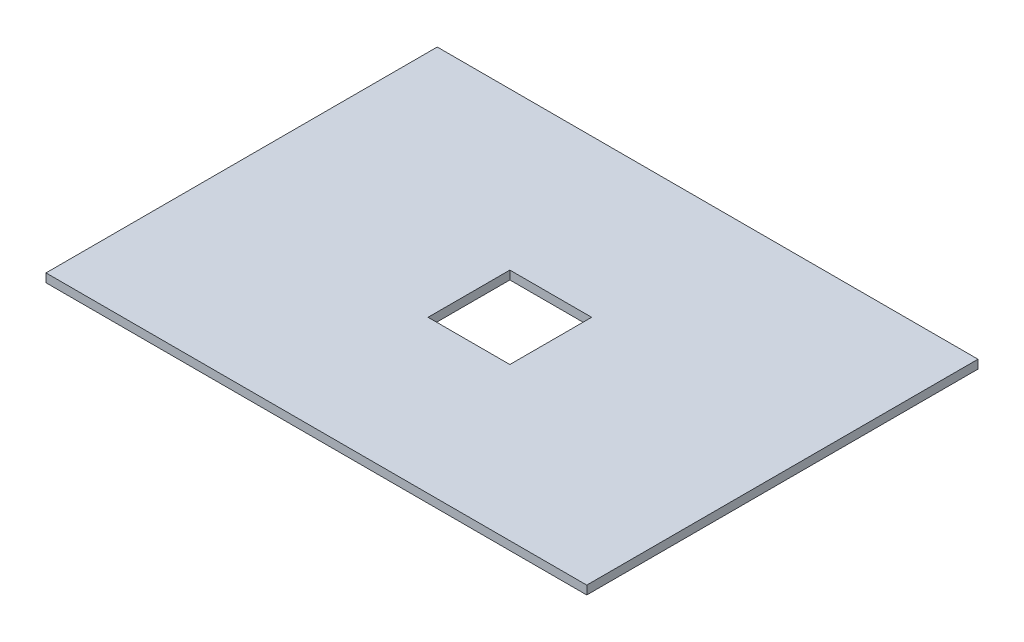
ISO-10303-21;
HEADER;
FILE_DESCRIPTION(('STEP AP214'),'2;1');
FILE_NAME('part.step','',(''),(''),'','','');
FILE_SCHEMA(('AUTOMOTIVE_DESIGN { 1 0 10303 214 1 1 1 1 }'));
ENDSEC;
DATA;
#1=APPLICATION_CONTEXT('core data for automotive mechanical design processes');
#2=APPLICATION_PROTOCOL_DEFINITION('international standard','automotive_design',2000,#1);
#3=PRODUCT_CONTEXT('',#1,'mechanical');
#4=PRODUCT('Part','Part','',(#3));
#5=PRODUCT_RELATED_PRODUCT_CATEGORY('part','',(#4));
#6=PRODUCT_DEFINITION_FORMATION('','',#4);
#7=PRODUCT_DEFINITION_CONTEXT('part definition',#1,'design');
#8=PRODUCT_DEFINITION('design','',#6,#7);
#9=PRODUCT_DEFINITION_SHAPE('','',#8);
#10=(LENGTH_UNIT() NAMED_UNIT(*) SI_UNIT(.MILLI.,.METRE.));
#11=(NAMED_UNIT(*) PLANE_ANGLE_UNIT() SI_UNIT($,.RADIAN.));
#12=(NAMED_UNIT(*) SI_UNIT($,.STERADIAN.) SOLID_ANGLE_UNIT());
#13=UNCERTAINTY_MEASURE_WITH_UNIT(LENGTH_MEASURE(1.E-05),#10,'distance_accuracy_value','');
#14=(GEOMETRIC_REPRESENTATION_CONTEXT(3) GLOBAL_UNCERTAINTY_ASSIGNED_CONTEXT((#13)) GLOBAL_UNIT_ASSIGNED_CONTEXT((#10,
#11,#12)) REPRESENTATION_CONTEXT('',''));
#15=CARTESIAN_POINT('',(0.,0.,0.));
#16=DIRECTION('',(0.,0.,1.));
#17=DIRECTION('',(1.,0.,0.));
#18=AXIS2_PLACEMENT_3D('',#15,#16,#17);
#19=CARTESIAN_POINT('',(0.,6.35,0.));
#20=DIRECTION('',(0.,-1.,0.));
#21=DIRECTION('',(0.,0.,-1.));
#22=AXIS2_PLACEMENT_3D('',#19,#20,#21);
#23=PLANE('',#22);
#24=DIRECTION('',(0.,0.,1.));
#25=VECTOR('',#24,1.);
#26=CARTESIAN_POINT('',(0.,6.35,0.));
#27=LINE('',#26,#25);
#28=CARTESIAN_POINT('',(0.,6.35,-289.4));
#29=VERTEX_POINT('',#28);
#30=CARTESIAN_POINT('',(0.,6.35,0.));
#31=VERTEX_POINT('',#30);
#32=EDGE_CURVE('E153',#29,#31,#27,.T.);
#33=ORIENTED_EDGE('',*,*,#32,.T.);
#34=DIRECTION('',(1.,0.,0.));
#35=VECTOR('',#34,1.);
#36=CARTESIAN_POINT('',(0.,6.35,0.));
#37=LINE('',#36,#35);
#38=CARTESIAN_POINT('',(400.,6.35,0.));
#39=VERTEX_POINT('',#38);
#40=EDGE_CURVE('E157',#31,#39,#37,.T.);
#41=ORIENTED_EDGE('',*,*,#40,.T.);
#42=DIRECTION('',(0.,0.,-1.));
#43=VECTOR('',#42,1.);
#44=CARTESIAN_POINT('',(400.,6.35,0.));
#45=LINE('',#44,#43);
#46=CARTESIAN_POINT('',(400.,6.35,-289.4));
#47=VERTEX_POINT('',#46);
#48=EDGE_CURVE('E161',#39,#47,#45,.T.);
#49=ORIENTED_EDGE('',*,*,#48,.T.);
#50=DIRECTION('',(-1.,0.,0.));
#51=VECTOR('',#50,1.);
#52=CARTESIAN_POINT('',(393.65,6.35,-289.4));
#53=LINE('',#52,#51);
#54=EDGE_CURVE('E164',#47,#29,#53,.T.);
#55=ORIENTED_EDGE('',*,*,#54,.T.);
#56=EDGE_LOOP('',(#33,#41,#49,#55));
#57=FACE_BOUND('',#56,.T.);
#58=DIRECTION('',(0.,0.,1.));
#59=VECTOR('',#58,1.);
#60=CARTESIAN_POINT('',(169.75,6.35,-173.36));
#61=LINE('',#60,#59);
#62=CARTESIAN_POINT('',(169.75,6.35,-173.36));
#63=VERTEX_POINT('',#62);
#64=CARTESIAN_POINT('',(169.75,6.35,-112.86));
#65=VERTEX_POINT('',#64);
#66=EDGE_CURVE('E105',#63,#65,#61,.T.);
#67=ORIENTED_EDGE('',*,*,#66,.F.);
#68=DIRECTION('',(-1.,0.,0.));
#69=VECTOR('',#68,1.);
#70=CARTESIAN_POINT('',(169.75,6.35,-173.36));
#71=LINE('',#70,#69);
#72=CARTESIAN_POINT('',(230.25,6.35,-173.36));
#73=VERTEX_POINT('',#72);
#74=EDGE_CURVE('E131',#73,#63,#71,.T.);
#75=ORIENTED_EDGE('',*,*,#74,.F.);
#76=DIRECTION('',(0.,0.,-1.));
#77=VECTOR('',#76,1.);
#78=CARTESIAN_POINT('',(230.25,6.35,-173.36));
#79=LINE('',#78,#77);
#80=CARTESIAN_POINT('',(230.25,6.35,-112.86));
#81=VERTEX_POINT('',#80);
#82=EDGE_CURVE('E127',#81,#73,#79,.T.);
#83=ORIENTED_EDGE('',*,*,#82,.F.);
#84=DIRECTION('',(1.,0.,0.));
#85=VECTOR('',#84,1.);
#86=CARTESIAN_POINT('',(169.75,6.35,-112.86));
#87=LINE('',#86,#85);
#88=EDGE_CURVE('E114',#65,#81,#87,.T.);
#89=ORIENTED_EDGE('',*,*,#88,.F.);
#90=EDGE_LOOP('',(#67,#75,#83,#89));
#91=FACE_BOUND('',#90,.T.);
#92=ADVANCED_FACE('F39',(#57,#91),#23,.F.);
#93=CARTESIAN_POINT('',(0.,0.,0.));
#94=DIRECTION('',(0.,-1.,0.));
#95=DIRECTION('',(0.,0.,-1.));
#96=AXIS2_PLACEMENT_3D('',#93,#94,#95);
#97=PLANE('',#96);
#98=DIRECTION('',(0.,0.,1.));
#99=VECTOR('',#98,1.);
#100=CARTESIAN_POINT('',(0.,0.,0.));
#101=LINE('',#100,#99);
#102=CARTESIAN_POINT('',(0.,0.,-289.4));
#103=VERTEX_POINT('',#102);
#104=CARTESIAN_POINT('',(0.,0.,0.));
#105=VERTEX_POINT('',#104);
#106=EDGE_CURVE('E123',#103,#105,#101,.T.);
#107=ORIENTED_EDGE('',*,*,#106,.F.);
#108=DIRECTION('',(-1.,0.,0.));
#109=VECTOR('',#108,1.);
#110=CARTESIAN_POINT('',(0.,0.,-289.4));
#111=LINE('',#110,#109);
#112=CARTESIAN_POINT('',(400.,0.,-289.4));
#113=VERTEX_POINT('',#112);
#114=EDGE_CURVE('E158',#113,#103,#111,.T.);
#115=ORIENTED_EDGE('',*,*,#114,.F.);
#116=DIRECTION('',(0.,0.,-1.));
#117=VECTOR('',#116,1.);
#118=CARTESIAN_POINT('',(400.,0.,0.));
#119=LINE('',#118,#117);
#120=CARTESIAN_POINT('',(400.,0.,0.));
#121=VERTEX_POINT('',#120);
#122=EDGE_CURVE('E174',#121,#113,#119,.T.);
#123=ORIENTED_EDGE('',*,*,#122,.F.);
#124=DIRECTION('',(1.,0.,0.));
#125=VECTOR('',#124,1.);
#126=CARTESIAN_POINT('',(0.,0.,0.));
#127=LINE('',#126,#125);
#128=EDGE_CURVE('E171',#105,#121,#127,.T.);
#129=ORIENTED_EDGE('',*,*,#128,.F.);
#130=EDGE_LOOP('',(#107,#115,#123,#129));
#131=FACE_BOUND('',#130,.T.);
#132=DIRECTION('',(-1.,0.,0.));
#133=VECTOR('',#132,1.);
#134=CARTESIAN_POINT('',(169.75,0.,-173.36));
#135=LINE('',#134,#133);
#136=CARTESIAN_POINT('',(230.25,0.,-173.36));
#137=VERTEX_POINT('',#136);
#138=CARTESIAN_POINT('',(169.75,0.,-173.36));
#139=VERTEX_POINT('',#138);
#140=EDGE_CURVE('E115',#137,#139,#135,.T.);
#141=ORIENTED_EDGE('',*,*,#140,.T.);
#142=DIRECTION('',(0.,0.,1.));
#143=VECTOR('',#142,1.);
#144=CARTESIAN_POINT('',(169.75,0.,-173.36));
#145=LINE('',#144,#143);
#146=CARTESIAN_POINT('',(169.75,0.,-112.86));
#147=VERTEX_POINT('',#146);
#148=EDGE_CURVE('E63',#139,#147,#145,.T.);
#149=ORIENTED_EDGE('',*,*,#148,.T.);
#150=DIRECTION('',(1.,0.,0.));
#151=VECTOR('',#150,1.);
#152=CARTESIAN_POINT('',(169.75,0.,-112.86));
#153=LINE('',#152,#151);
#154=CARTESIAN_POINT('',(230.25,0.,-112.86));
#155=VERTEX_POINT('',#154);
#156=EDGE_CURVE('E121',#147,#155,#153,.T.);
#157=ORIENTED_EDGE('',*,*,#156,.T.);
#158=DIRECTION('',(0.,0.,-1.));
#159=VECTOR('',#158,1.);
#160=CARTESIAN_POINT('',(230.25,0.,-173.36));
#161=LINE('',#160,#159);
#162=EDGE_CURVE('E140',#155,#137,#161,.T.);
#163=ORIENTED_EDGE('',*,*,#162,.T.);
#164=EDGE_LOOP('',(#141,#149,#157,#163));
#165=FACE_BOUND('',#164,.T.);
#166=ADVANCED_FACE('F197',(#131,#165),#97,.T.);
#167=CARTESIAN_POINT('',(0.,6.35,0.));
#168=DIRECTION('',(1.,0.,0.));
#169=DIRECTION('',(0.,0.,-1.));
#170=AXIS2_PLACEMENT_3D('',#167,#168,#169);
#171=PLANE('',#170);
#172=ORIENTED_EDGE('',*,*,#106,.T.);
#173=DIRECTION('',(0.,-1.,0.));
#174=VECTOR('',#173,1.);
#175=CARTESIAN_POINT('',(0.,6.35,0.));
#176=LINE('',#175,#174);
#177=EDGE_CURVE('E11',#31,#105,#176,.T.);
#178=ORIENTED_EDGE('',*,*,#177,.F.);
#179=ORIENTED_EDGE('',*,*,#32,.F.);
#180=DIRECTION('',(0.,-1.,0.));
#181=VECTOR('',#180,1.);
#182=CARTESIAN_POINT('',(0.,6.35,-289.4));
#183=LINE('',#182,#181);
#184=EDGE_CURVE('E167',#29,#103,#183,.T.);
#185=ORIENTED_EDGE('',*,*,#184,.T.);
#186=EDGE_LOOP('',(#172,#178,#179,#185));
#187=FACE_BOUND('',#186,.T.);
#188=ADVANCED_FACE('F41',(#187),#171,.F.);
#189=CARTESIAN_POINT('',(0.,6.35,0.));
#190=DIRECTION('',(0.,0.,-1.));
#191=DIRECTION('',(-1.,0.,0.));
#192=AXIS2_PLACEMENT_3D('',#189,#190,#191);
#193=PLANE('',#192);
#194=ORIENTED_EDGE('',*,*,#128,.T.);
#195=DIRECTION('',(0.,-1.,0.));
#196=VECTOR('',#195,1.);
#197=CARTESIAN_POINT('',(400.,6.35,0.));
#198=LINE('',#197,#196);
#199=EDGE_CURVE('E48',#39,#121,#198,.T.);
#200=ORIENTED_EDGE('',*,*,#199,.F.);
#201=ORIENTED_EDGE('',*,*,#40,.F.);
#202=ORIENTED_EDGE('',*,*,#177,.T.);
#203=EDGE_LOOP('',(#194,#200,#201,#202));
#204=FACE_BOUND('',#203,.T.);
#205=ADVANCED_FACE('F207',(#204),#193,.F.);
#206=CARTESIAN_POINT('',(400.,6.35,0.));
#207=DIRECTION('',(-1.,0.,0.));
#208=DIRECTION('',(0.,0.,1.));
#209=AXIS2_PLACEMENT_3D('',#206,#207,#208);
#210=PLANE('',#209);
#211=ORIENTED_EDGE('',*,*,#122,.T.);
#212=DIRECTION('',(0.,-1.,0.));
#213=VECTOR('',#212,1.);
#214=CARTESIAN_POINT('',(400.,6.35,-289.4));
#215=LINE('',#214,#213);
#216=EDGE_CURVE('E183',#47,#113,#215,.T.);
#217=ORIENTED_EDGE('',*,*,#216,.F.);
#218=ORIENTED_EDGE('',*,*,#48,.F.);
#219=ORIENTED_EDGE('',*,*,#199,.T.);
#220=EDGE_LOOP('',(#211,#217,#218,#219));
#221=FACE_BOUND('',#220,.T.);
#222=ADVANCED_FACE('F192',(#221),#210,.F.);
#223=CARTESIAN_POINT('',(0.,6.35,-289.4));
#224=DIRECTION('',(0.,0.,1.));
#225=DIRECTION('',(1.,0.,0.));
#226=AXIS2_PLACEMENT_3D('',#223,#224,#225);
#227=PLANE('',#226);
#228=ORIENTED_EDGE('',*,*,#114,.T.);
#229=ORIENTED_EDGE('',*,*,#184,.F.);
#230=ORIENTED_EDGE('',*,*,#54,.F.);
#231=ORIENTED_EDGE('',*,*,#216,.T.);
#232=EDGE_LOOP('',(#228,#229,#230,#231));
#233=FACE_BOUND('',#232,.T.);
#234=ADVANCED_FACE('F201',(#233),#227,.F.);
#235=CARTESIAN_POINT('',(169.75,6.35,-173.36));
#236=DIRECTION('',(1.,0.,0.));
#237=DIRECTION('',(0.,0.,-1.));
#238=AXIS2_PLACEMENT_3D('',#235,#236,#237);
#239=PLANE('',#238);
#240=ORIENTED_EDGE('',*,*,#148,.F.);
#241=DIRECTION('',(0.,-1.,0.));
#242=VECTOR('',#241,1.);
#243=CARTESIAN_POINT('',(169.75,6.35,-173.36));
#244=LINE('',#243,#242);
#245=EDGE_CURVE('E109',#63,#139,#244,.T.);
#246=ORIENTED_EDGE('',*,*,#245,.F.);
#247=ORIENTED_EDGE('',*,*,#66,.T.);
#248=DIRECTION('',(0.,-1.,0.));
#249=VECTOR('',#248,1.);
#250=CARTESIAN_POINT('',(169.75,6.35,-112.86));
#251=LINE('',#250,#249);
#252=EDGE_CURVE('E108',#65,#147,#251,.T.);
#253=ORIENTED_EDGE('',*,*,#252,.T.);
#254=EDGE_LOOP('',(#240,#246,#247,#253));
#255=FACE_BOUND('',#254,.T.);
#256=ADVANCED_FACE('F107',(#255),#239,.T.);
#257=CARTESIAN_POINT('',(169.75,6.35,-112.86));
#258=DIRECTION('',(0.,0.,-1.));
#259=DIRECTION('',(-1.,0.,0.));
#260=AXIS2_PLACEMENT_3D('',#257,#258,#259);
#261=PLANE('',#260);
#262=ORIENTED_EDGE('',*,*,#156,.F.);
#263=ORIENTED_EDGE('',*,*,#252,.F.);
#264=ORIENTED_EDGE('',*,*,#88,.T.);
#265=DIRECTION('',(0.,-1.,0.));
#266=VECTOR('',#265,1.);
#267=CARTESIAN_POINT('',(230.25,6.35,-112.86));
#268=LINE('',#267,#266);
#269=EDGE_CURVE('E124',#81,#155,#268,.T.);
#270=ORIENTED_EDGE('',*,*,#269,.T.);
#271=EDGE_LOOP('',(#262,#263,#264,#270));
#272=FACE_BOUND('',#271,.T.);
#273=ADVANCED_FACE('F118',(#272),#261,.T.);
#274=CARTESIAN_POINT('',(230.25,6.35,-173.36));
#275=DIRECTION('',(-1.,0.,0.));
#276=DIRECTION('',(0.,0.,1.));
#277=AXIS2_PLACEMENT_3D('',#274,#275,#276);
#278=PLANE('',#277);
#279=ORIENTED_EDGE('',*,*,#162,.F.);
#280=ORIENTED_EDGE('',*,*,#269,.F.);
#281=ORIENTED_EDGE('',*,*,#82,.T.);
#282=DIRECTION('',(0.,-1.,0.));
#283=VECTOR('',#282,1.);
#284=CARTESIAN_POINT('',(230.25,6.35,-173.36));
#285=LINE('',#284,#283);
#286=EDGE_CURVE('E55',#73,#137,#285,.T.);
#287=ORIENTED_EDGE('',*,*,#286,.T.);
#288=EDGE_LOOP('',(#279,#280,#281,#287));
#289=FACE_BOUND('',#288,.T.);
#290=ADVANCED_FACE('F230',(#289),#278,.T.);
#291=CARTESIAN_POINT('',(169.75,6.35,-173.36));
#292=DIRECTION('',(0.,0.,1.));
#293=DIRECTION('',(1.,0.,0.));
#294=AXIS2_PLACEMENT_3D('',#291,#292,#293);
#295=PLANE('',#294);
#296=ORIENTED_EDGE('',*,*,#140,.F.);
#297=ORIENTED_EDGE('',*,*,#286,.F.);
#298=ORIENTED_EDGE('',*,*,#74,.T.);
#299=ORIENTED_EDGE('',*,*,#245,.T.);
#300=EDGE_LOOP('',(#296,#297,#298,#299));
#301=FACE_BOUND('',#300,.T.);
#302=ADVANCED_FACE('F234',(#301),#295,.T.);
#303=CLOSED_SHELL('',(#92,#166,#188,#205,#222,#234,#256,#273,#290,#302));
#304=MANIFOLD_SOLID_BREP('B2',#303);
#305=ADVANCED_BREP_SHAPE_REPRESENTATION('',(#18,#304),#14);
#306=SHAPE_DEFINITION_REPRESENTATION(#9,#305);
ENDSEC;
END-ISO-10303-21;
